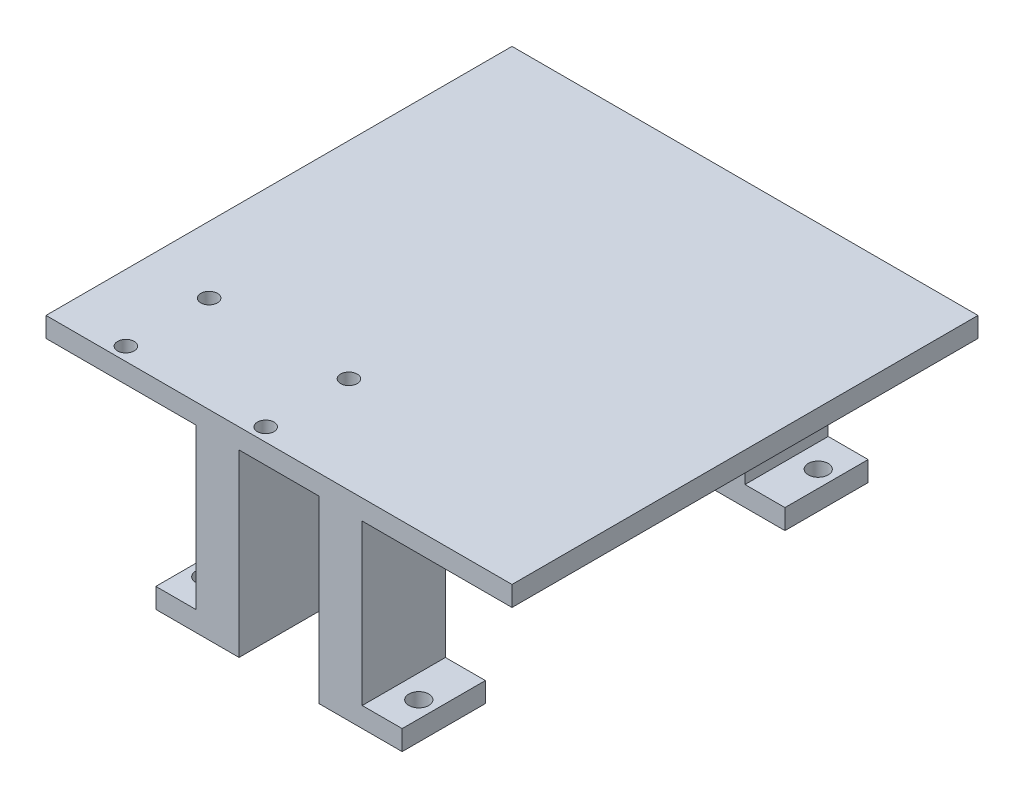
ISO-10303-21;
HEADER;
FILE_DESCRIPTION(('STEP AP214'),'2;1');
FILE_NAME('part.step','',(''),(''),'','','');
FILE_SCHEMA(('AUTOMOTIVE_DESIGN { 1 0 10303 214 1 1 1 1 }'));
ENDSEC;
DATA;
#1=APPLICATION_CONTEXT('core data for automotive mechanical design processes');
#2=APPLICATION_PROTOCOL_DEFINITION('international standard','automotive_design',2000,#1);
#3=PRODUCT_CONTEXT('',#1,'mechanical');
#4=PRODUCT('Part','Part','',(#3));
#5=PRODUCT_RELATED_PRODUCT_CATEGORY('part','',(#4));
#6=PRODUCT_DEFINITION_FORMATION('','',#4);
#7=PRODUCT_DEFINITION_CONTEXT('part definition',#1,'design');
#8=PRODUCT_DEFINITION('design','',#6,#7);
#9=PRODUCT_DEFINITION_SHAPE('','',#8);
#10=(LENGTH_UNIT() NAMED_UNIT(*) SI_UNIT(.MILLI.,.METRE.));
#11=(NAMED_UNIT(*) PLANE_ANGLE_UNIT() SI_UNIT($,.RADIAN.));
#12=(NAMED_UNIT(*) SI_UNIT($,.STERADIAN.) SOLID_ANGLE_UNIT());
#13=UNCERTAINTY_MEASURE_WITH_UNIT(LENGTH_MEASURE(1.E-05),#10,'distance_accuracy_value','');
#14=(GEOMETRIC_REPRESENTATION_CONTEXT(3) GLOBAL_UNCERTAINTY_ASSIGNED_CONTEXT((#13)) GLOBAL_UNIT_ASSIGNED_CONTEXT((#10,
#11,#12)) REPRESENTATION_CONTEXT('',''));
#15=CARTESIAN_POINT('',(0.,0.,0.));
#16=DIRECTION('',(0.,0.,1.));
#17=DIRECTION('',(1.,0.,0.));
#18=AXIS2_PLACEMENT_3D('',#15,#16,#17);
#19=CARTESIAN_POINT('',(18.5,0.,35.));
#20=DIRECTION('',(0.,1.,0.));
#21=DIRECTION('',(0.,0.,1.));
#22=AXIS2_PLACEMENT_3D('',#19,#20,#21);
#23=PLANE('',#22);
#24=CARTESIAN_POINT('',(-16.,0.,30.));
#25=DIRECTION('',(0.,1.,0.));
#26=DIRECTION('',(0.,0.,1.));
#27=AXIS2_PLACEMENT_3D('',#24,#25,#26);
#28=CIRCLE('',#27,1.5);
#29=CARTESIAN_POINT('',(-16.,0.,31.5));
#30=VERTEX_POINT('',#29);
#31=EDGE_CURVE('E374',#30,#30,#28,.T.);
#32=ORIENTED_EDGE('',*,*,#31,.T.);
#33=EDGE_LOOP('',(#32));
#34=FACE_BOUND('',#33,.T.);
#35=DIRECTION('',(1.,0.,0.));
#36=VECTOR('',#35,1.);
#37=CARTESIAN_POINT('',(-35.,0.,22.5));
#38=LINE('',#37,#36);
#39=CARTESIAN_POINT('',(-18.5,0.,22.5));
#40=VERTEX_POINT('',#39);
#41=CARTESIAN_POINT('',(-6.,0.,22.5));
#42=VERTEX_POINT('',#41);
#43=EDGE_CURVE('E480',#40,#42,#38,.T.);
#44=ORIENTED_EDGE('',*,*,#43,.T.);
#45=DIRECTION('',(0.,0.,1.));
#46=VECTOR('',#45,1.);
#47=CARTESIAN_POINT('',(-6.,0.,-40.));
#48=LINE('',#47,#46);
#49=CARTESIAN_POINT('',(-6.,0.,35.));
#50=VERTEX_POINT('',#49);
#51=EDGE_CURVE('E237',#42,#50,#48,.T.);
#52=ORIENTED_EDGE('',*,*,#51,.T.);
#53=DIRECTION('',(1.,0.,0.));
#54=VECTOR('',#53,1.);
#55=CARTESIAN_POINT('',(18.5,0.,35.));
#56=LINE('',#55,#54);
#57=CARTESIAN_POINT('',(-18.5,0.,35.));
#58=VERTEX_POINT('',#57);
#59=EDGE_CURVE('E522',#58,#50,#56,.T.);
#60=ORIENTED_EDGE('',*,*,#59,.F.);
#61=DIRECTION('',(0.,0.,-1.));
#62=VECTOR('',#61,1.);
#63=CARTESIAN_POINT('',(-18.5,0.,35.));
#64=LINE('',#63,#62);
#65=EDGE_CURVE('E306',#58,#40,#64,.T.);
#66=ORIENTED_EDGE('',*,*,#65,.T.);
#67=EDGE_LOOP('',(#44,#52,#60,#66));
#68=FACE_BOUND('',#67,.T.);
#69=ADVANCED_FACE('F39',(#34,#68),#23,.F.);
#70=CARTESIAN_POINT('',(-16.,0.,-30.));
#71=DIRECTION('',(0.,1.,0.));
#72=DIRECTION('',(0.,0.,1.));
#73=AXIS2_PLACEMENT_3D('',#70,#71,#72);
#74=CIRCLE('',#73,1.5);
#75=CARTESIAN_POINT('',(-16.,0.,-28.5));
#76=VERTEX_POINT('',#75);
#77=EDGE_CURVE('E415',#76,#76,#74,.T.);
#78=ORIENTED_EDGE('',*,*,#77,.T.);
#79=EDGE_LOOP('',(#78));
#80=FACE_BOUND('',#79,.T.);
#81=DIRECTION('',(1.,0.,0.));
#82=VECTOR('',#81,1.);
#83=CARTESIAN_POINT('',(18.5,0.,-35.));
#84=LINE('',#83,#82);
#85=CARTESIAN_POINT('',(-18.5,0.,-35.));
#86=VERTEX_POINT('',#85);
#87=CARTESIAN_POINT('',(-6.,0.,-35.));
#88=VERTEX_POINT('',#87);
#89=EDGE_CURVE('E244',#86,#88,#84,.T.);
#90=ORIENTED_EDGE('',*,*,#89,.T.);
#91=CARTESIAN_POINT('',(-6.,0.,-22.5));
#92=VERTEX_POINT('',#91);
#93=EDGE_CURVE('E226',#88,#92,#48,.T.);
#94=ORIENTED_EDGE('',*,*,#93,.T.);
#95=DIRECTION('',(1.,0.,0.));
#96=VECTOR('',#95,1.);
#97=CARTESIAN_POINT('',(-35.,0.,-22.5));
#98=LINE('',#97,#96);
#99=CARTESIAN_POINT('',(-18.5,0.,-22.5));
#100=VERTEX_POINT('',#99);
#101=EDGE_CURVE('E476',#100,#92,#98,.T.);
#102=ORIENTED_EDGE('',*,*,#101,.F.);
#103=EDGE_CURVE('E253',#100,#86,#64,.T.);
#104=ORIENTED_EDGE('',*,*,#103,.T.);
#105=EDGE_LOOP('',(#90,#94,#102,#104));
#106=FACE_BOUND('',#105,.T.);
#107=ADVANCED_FACE('F251',(#80,#106),#23,.F.);
#108=CARTESIAN_POINT('',(-35.,27.,22.5));
#109=DIRECTION('',(0.,0.,1.));
#110=DIRECTION('',(0.,-1.,0.));
#111=AXIS2_PLACEMENT_3D('',#108,#109,#110);
#112=PLANE('',#111);
#113=DIRECTION('',(1.,0.,0.));
#114=VECTOR('',#113,1.);
#115=CARTESIAN_POINT('',(-35.,27.,22.5));
#116=LINE('',#115,#114);
#117=CARTESIAN_POINT('',(-12.5,27.,22.5));
#118=VERTEX_POINT('',#117);
#119=CARTESIAN_POINT('',(-6.,26.9999999999999,22.5));
#120=VERTEX_POINT('',#119);
#121=EDGE_CURVE('E465',#118,#120,#116,.T.);
#122=ORIENTED_EDGE('',*,*,#121,.T.);
#123=DIRECTION('',(0.,-1.,0.));
#124=VECTOR('',#123,1.);
#125=CARTESIAN_POINT('',(-6.,27.,22.5));
#126=LINE('',#125,#124);
#127=EDGE_CURVE('E249',#120,#42,#126,.T.);
#128=ORIENTED_EDGE('',*,*,#127,.T.);
#129=ORIENTED_EDGE('',*,*,#43,.F.);
#130=DIRECTION('',(0.,-1.,0.));
#131=VECTOR('',#130,1.);
#132=CARTESIAN_POINT('',(-18.5,0.,22.5));
#133=LINE('',#132,#131);
#134=CARTESIAN_POINT('',(-18.5,3.,22.5));
#135=VERTEX_POINT('',#134);
#136=EDGE_CURVE('E363',#135,#40,#133,.T.);
#137=ORIENTED_EDGE('',*,*,#136,.F.);
#138=DIRECTION('',(-1.,0.,0.));
#139=VECTOR('',#138,1.);
#140=CARTESIAN_POINT('',(-18.5,3.,22.5));
#141=LINE('',#140,#139);
#142=CARTESIAN_POINT('',(-12.5,3.,22.5));
#143=VERTEX_POINT('',#142);
#144=EDGE_CURVE('E503',#143,#135,#141,.T.);
#145=ORIENTED_EDGE('',*,*,#144,.F.);
#146=DIRECTION('',(0.,-1.,0.));
#147=VECTOR('',#146,1.);
#148=CARTESIAN_POINT('',(-12.5,3.,22.5));
#149=LINE('',#148,#147);
#150=EDGE_CURVE('E507',#118,#143,#149,.T.);
#151=ORIENTED_EDGE('',*,*,#150,.F.);
#152=EDGE_LOOP('',(#122,#128,#129,#137,#145,#151));
#153=FACE_BOUND('',#152,.T.);
#154=ADVANCED_FACE('F674',(#153),#112,.F.);
#155=CARTESIAN_POINT('',(-35.,27.,-22.5));
#156=DIRECTION('',(0.,0.,-1.));
#157=DIRECTION('',(0.,1.,0.));
#158=AXIS2_PLACEMENT_3D('',#155,#156,#157);
#159=PLANE('',#158);
#160=ORIENTED_EDGE('',*,*,#101,.T.);
#161=DIRECTION('',(0.,1.,0.));
#162=VECTOR('',#161,1.);
#163=CARTESIAN_POINT('',(-6.,27.,-22.5));
#164=LINE('',#163,#162);
#165=CARTESIAN_POINT('',(-6.,26.9999999999999,-22.5));
#166=VERTEX_POINT('',#165);
#167=EDGE_CURVE('E11',#92,#166,#164,.T.);
#168=ORIENTED_EDGE('',*,*,#167,.T.);
#169=DIRECTION('',(1.,0.,0.));
#170=VECTOR('',#169,1.);
#171=CARTESIAN_POINT('',(-35.,27.,-22.5));
#172=LINE('',#171,#170);
#173=CARTESIAN_POINT('',(-12.5,27.,-22.5));
#174=VERTEX_POINT('',#173);
#175=EDGE_CURVE('E471',#174,#166,#172,.T.);
#176=ORIENTED_EDGE('',*,*,#175,.F.);
#177=DIRECTION('',(0.,1.,0.));
#178=VECTOR('',#177,1.);
#179=CARTESIAN_POINT('',(-12.5,2.99999999999999,-22.5));
#180=LINE('',#179,#178);
#181=CARTESIAN_POINT('',(-12.5,3.,-22.5));
#182=VERTEX_POINT('',#181);
#183=EDGE_CURVE('E487',#182,#174,#180,.T.);
#184=ORIENTED_EDGE('',*,*,#183,.F.);
#185=DIRECTION('',(1.,0.,0.));
#186=VECTOR('',#185,1.);
#187=CARTESIAN_POINT('',(-18.5,3.,-22.5));
#188=LINE('',#187,#186);
#189=CARTESIAN_POINT('',(-18.5,3.,-22.5));
#190=VERTEX_POINT('',#189);
#191=EDGE_CURVE('E469',#190,#182,#188,.T.);
#192=ORIENTED_EDGE('',*,*,#191,.F.);
#193=DIRECTION('',(0.,1.,0.));
#194=VECTOR('',#193,1.);
#195=CARTESIAN_POINT('',(-18.5,0.,-22.5));
#196=LINE('',#195,#194);
#197=EDGE_CURVE('E359',#100,#190,#196,.T.);
#198=ORIENTED_EDGE('',*,*,#197,.F.);
#199=EDGE_LOOP('',(#160,#168,#176,#184,#192,#198));
#200=FACE_BOUND('',#199,.T.);
#201=ADVANCED_FACE('F712',(#200),#159,.F.);
#202=CARTESIAN_POINT('',(16.,0.,30.));
#203=DIRECTION('',(0.,1.,0.));
#204=DIRECTION('',(0.,0.,1.));
#205=AXIS2_PLACEMENT_3D('',#202,#203,#204);
#206=CIRCLE('',#205,1.5);
#207=CARTESIAN_POINT('',(16.,0.,31.5));
#208=VERTEX_POINT('',#207);
#209=EDGE_CURVE('E416',#208,#208,#206,.T.);
#210=ORIENTED_EDGE('',*,*,#209,.T.);
#211=EDGE_LOOP('',(#210));
#212=FACE_BOUND('',#211,.T.);
#213=CARTESIAN_POINT('',(6.,0.,35.));
#214=VERTEX_POINT('',#213);
#215=CARTESIAN_POINT('',(18.5,0.,35.));
#216=VERTEX_POINT('',#215);
#217=EDGE_CURVE('E305',#214,#216,#56,.T.);
#218=ORIENTED_EDGE('',*,*,#217,.F.);
#219=DIRECTION('',(0.,0.,1.));
#220=VECTOR('',#219,1.);
#221=CARTESIAN_POINT('',(6.,0.,-40.));
#222=LINE('',#221,#220);
#223=CARTESIAN_POINT('',(6.,0.,22.5));
#224=VERTEX_POINT('',#223);
#225=EDGE_CURVE('E236',#224,#214,#222,.T.);
#226=ORIENTED_EDGE('',*,*,#225,.F.);
#227=CARTESIAN_POINT('',(18.5,0.,22.5));
#228=VERTEX_POINT('',#227);
#229=EDGE_CURVE('E464',#224,#228,#38,.T.);
#230=ORIENTED_EDGE('',*,*,#229,.T.);
#231=DIRECTION('',(0.,0.,-1.));
#232=VECTOR('',#231,1.);
#233=CARTESIAN_POINT('',(18.5,0.,35.));
#234=LINE('',#233,#232);
#235=EDGE_CURVE('E355',#216,#228,#234,.T.);
#236=ORIENTED_EDGE('',*,*,#235,.F.);
#237=EDGE_LOOP('',(#218,#226,#230,#236));
#238=FACE_BOUND('',#237,.T.);
#239=ADVANCED_FACE('F668',(#212,#238),#23,.F.);
#240=CARTESIAN_POINT('',(18.5,3.,35.));
#241=DIRECTION('',(-1.,0.,0.));
#242=DIRECTION('',(0.,0.,1.));
#243=AXIS2_PLACEMENT_3D('',#240,#241,#242);
#244=PLANE('',#243);
#245=ORIENTED_EDGE('',*,*,#235,.T.);
#246=DIRECTION('',(0.,1.,0.));
#247=VECTOR('',#246,1.);
#248=CARTESIAN_POINT('',(18.5,3.,22.5));
#249=LINE('',#248,#247);
#250=CARTESIAN_POINT('',(18.5,3.,22.5));
#251=VERTEX_POINT('',#250);
#252=EDGE_CURVE('E264',#228,#251,#249,.T.);
#253=ORIENTED_EDGE('',*,*,#252,.T.);
#254=DIRECTION('',(0.,0.,-1.));
#255=VECTOR('',#254,1.);
#256=CARTESIAN_POINT('',(18.5,3.,35.));
#257=LINE('',#256,#255);
#258=CARTESIAN_POINT('',(18.5,3.,35.));
#259=VERTEX_POINT('',#258);
#260=EDGE_CURVE('E350',#259,#251,#257,.T.);
#261=ORIENTED_EDGE('',*,*,#260,.F.);
#262=DIRECTION('',(0.,1.,0.));
#263=VECTOR('',#262,1.);
#264=CARTESIAN_POINT('',(18.5,3.,35.));
#265=LINE('',#264,#263);
#266=EDGE_CURVE('E526',#216,#259,#265,.T.);
#267=ORIENTED_EDGE('',*,*,#266,.F.);
#268=EDGE_LOOP('',(#245,#253,#261,#267));
#269=FACE_BOUND('',#268,.T.);
#270=ADVANCED_FACE('F663',(#269),#244,.F.);
#271=CARTESIAN_POINT('',(12.5,3.,35.));
#272=DIRECTION('',(0.,-1.,0.));
#273=DIRECTION('',(0.,0.,-1.));
#274=AXIS2_PLACEMENT_3D('',#271,#272,#273);
#275=PLANE('',#274);
#276=CARTESIAN_POINT('',(16.,3.,30.));
#277=DIRECTION('',(0.,-1.,0.));
#278=DIRECTION('',(0.,0.,-1.));
#279=AXIS2_PLACEMENT_3D('',#276,#277,#278);
#280=CIRCLE('',#279,1.5);
#281=CARTESIAN_POINT('',(16.,3.,28.5));
#282=VERTEX_POINT('',#281);
#283=EDGE_CURVE('E382',#282,#282,#280,.F.);
#284=ORIENTED_EDGE('',*,*,#283,.F.);
#285=EDGE_LOOP('',(#284));
#286=FACE_BOUND('',#285,.T.);
#287=ORIENTED_EDGE('',*,*,#260,.T.);
#288=DIRECTION('',(-1.,0.,0.));
#289=VECTOR('',#288,1.);
#290=CARTESIAN_POINT('',(12.5,3.,22.5));
#291=LINE('',#290,#289);
#292=CARTESIAN_POINT('',(12.5,3.,22.5));
#293=VERTEX_POINT('',#292);
#294=EDGE_CURVE('E515',#251,#293,#291,.T.);
#295=ORIENTED_EDGE('',*,*,#294,.T.);
#296=DIRECTION('',(0.,0.,-1.));
#297=VECTOR('',#296,1.);
#298=CARTESIAN_POINT('',(12.5,3.,35.));
#299=LINE('',#298,#297);
#300=CARTESIAN_POINT('',(12.5,3.,35.));
#301=VERTEX_POINT('',#300);
#302=EDGE_CURVE('E345',#301,#293,#299,.T.);
#303=ORIENTED_EDGE('',*,*,#302,.F.);
#304=DIRECTION('',(-1.,0.,0.));
#305=VECTOR('',#304,1.);
#306=CARTESIAN_POINT('',(12.5,3.,35.));
#307=LINE('',#306,#305);
#308=EDGE_CURVE('E529',#259,#301,#307,.T.);
#309=ORIENTED_EDGE('',*,*,#308,.F.);
#310=EDGE_LOOP('',(#287,#295,#303,#309));
#311=FACE_BOUND('',#310,.T.);
#312=ADVANCED_FACE('F658',(#286,#311),#275,.F.);
#313=CARTESIAN_POINT('',(12.5,27.,35.));
#314=DIRECTION('',(-1.,0.,0.));
#315=DIRECTION('',(0.,-1.,0.));
#316=AXIS2_PLACEMENT_3D('',#313,#314,#315);
#317=PLANE('',#316);
#318=ORIENTED_EDGE('',*,*,#302,.T.);
#319=DIRECTION('',(0.,1.,0.));
#320=VECTOR('',#319,1.);
#321=CARTESIAN_POINT('',(12.5,27.,22.5));
#322=LINE('',#321,#320);
#323=CARTESIAN_POINT('',(12.5,27.,22.5));
#324=VERTEX_POINT('',#323);
#325=EDGE_CURVE('E511',#293,#324,#322,.T.);
#326=ORIENTED_EDGE('',*,*,#325,.T.);
#327=DIRECTION('',(0.,0.,-1.));
#328=VECTOR('',#327,1.);
#329=CARTESIAN_POINT('',(12.5,27.,35.));
#330=LINE('',#329,#328);
#331=CARTESIAN_POINT('',(12.5,27.,35.));
#332=VERTEX_POINT('',#331);
#333=EDGE_CURVE('E340',#332,#324,#330,.T.);
#334=ORIENTED_EDGE('',*,*,#333,.F.);
#335=DIRECTION('',(0.,1.,0.));
#336=VECTOR('',#335,1.);
#337=CARTESIAN_POINT('',(12.5,27.,35.));
#338=LINE('',#337,#336);
#339=EDGE_CURVE('E532',#301,#332,#338,.T.);
#340=ORIENTED_EDGE('',*,*,#339,.F.);
#341=EDGE_LOOP('',(#318,#326,#334,#340));
#342=FACE_BOUND('',#341,.T.);
#343=ADVANCED_FACE('F651',(#342),#317,.F.);
#344=CARTESIAN_POINT('',(-12.5,3.,35.));
#345=DIRECTION('',(1.,0.,0.));
#346=DIRECTION('',(0.,1.,0.));
#347=AXIS2_PLACEMENT_3D('',#344,#345,#346);
#348=PLANE('',#347);
#349=DIRECTION('',(0.,0.,-1.));
#350=VECTOR('',#349,1.);
#351=CARTESIAN_POINT('',(-12.5,27.,35.));
#352=LINE('',#351,#350);
#353=CARTESIAN_POINT('',(-12.5,27.,35.));
#354=VERTEX_POINT('',#353);
#355=EDGE_CURVE('E321',#354,#118,#352,.T.);
#356=ORIENTED_EDGE('',*,*,#355,.T.);
#357=ORIENTED_EDGE('',*,*,#150,.T.);
#358=DIRECTION('',(0.,0.,-1.));
#359=VECTOR('',#358,1.);
#360=CARTESIAN_POINT('',(-12.5,3.,35.));
#361=LINE('',#360,#359);
#362=CARTESIAN_POINT('',(-12.5,3.,35.));
#363=VERTEX_POINT('',#362);
#364=EDGE_CURVE('E316',#363,#143,#361,.T.);
#365=ORIENTED_EDGE('',*,*,#364,.F.);
#366=DIRECTION('',(0.,-1.,0.));
#367=VECTOR('',#366,1.);
#368=CARTESIAN_POINT('',(-12.5,3.,35.));
#369=LINE('',#368,#367);
#370=EDGE_CURVE('E550',#354,#363,#369,.T.);
#371=ORIENTED_EDGE('',*,*,#370,.F.);
#372=EDGE_LOOP('',(#356,#357,#365,#371));
#373=FACE_BOUND('',#372,.T.);
#374=ADVANCED_FACE('F682',(#373),#348,.F.);
#375=CARTESIAN_POINT('',(-18.5,3.,35.));
#376=DIRECTION('',(0.,-1.,0.));
#377=DIRECTION('',(0.,0.,-1.));
#378=AXIS2_PLACEMENT_3D('',#375,#376,#377);
#379=PLANE('',#378);
#380=CARTESIAN_POINT('',(-16.,3.,30.));
#381=DIRECTION('',(0.,-1.,0.));
#382=DIRECTION('',(0.,0.,-1.));
#383=AXIS2_PLACEMENT_3D('',#380,#381,#382);
#384=CIRCLE('',#383,1.5);
#385=CARTESIAN_POINT('',(-16.,3.,28.5));
#386=VERTEX_POINT('',#385);
#387=EDGE_CURVE('E378',#386,#386,#384,.F.);
#388=ORIENTED_EDGE('',*,*,#387,.F.);
#389=EDGE_LOOP('',(#388));
#390=FACE_BOUND('',#389,.T.);
#391=ORIENTED_EDGE('',*,*,#364,.T.);
#392=ORIENTED_EDGE('',*,*,#144,.T.);
#393=DIRECTION('',(0.,0.,-1.));
#394=VECTOR('',#393,1.);
#395=CARTESIAN_POINT('',(-18.5,3.,35.));
#396=LINE('',#395,#394);
#397=CARTESIAN_POINT('',(-18.5,3.,35.));
#398=VERTEX_POINT('',#397);
#399=EDGE_CURVE('E311',#398,#135,#396,.T.);
#400=ORIENTED_EDGE('',*,*,#399,.F.);
#401=DIRECTION('',(-1.,0.,0.));
#402=VECTOR('',#401,1.);
#403=CARTESIAN_POINT('',(-18.5,3.,35.));
#404=LINE('',#403,#402);
#405=EDGE_CURVE('E552',#363,#398,#404,.T.);
#406=ORIENTED_EDGE('',*,*,#405,.F.);
#407=EDGE_LOOP('',(#391,#392,#400,#406));
#408=FACE_BOUND('',#407,.T.);
#409=ADVANCED_FACE('F680',(#390,#408),#379,.F.);
#410=CARTESIAN_POINT('',(-18.5,0.,35.));
#411=DIRECTION('',(1.,0.,0.));
#412=DIRECTION('',(0.,0.,-1.));
#413=AXIS2_PLACEMENT_3D('',#410,#411,#412);
#414=PLANE('',#413);
#415=ORIENTED_EDGE('',*,*,#399,.T.);
#416=ORIENTED_EDGE('',*,*,#136,.T.);
#417=ORIENTED_EDGE('',*,*,#65,.F.);
#418=DIRECTION('',(0.,-1.,0.));
#419=VECTOR('',#418,1.);
#420=CARTESIAN_POINT('',(-18.5,0.,35.));
#421=LINE('',#420,#419);
#422=EDGE_CURVE('E266',#398,#58,#421,.T.);
#423=ORIENTED_EDGE('',*,*,#422,.F.);
#424=EDGE_LOOP('',(#415,#416,#417,#423));
#425=FACE_BOUND('',#424,.T.);
#426=ADVANCED_FACE('F678',(#425),#414,.F.);
#427=CARTESIAN_POINT('',(16.,0.,-30.));
#428=DIRECTION('',(0.,1.,0.));
#429=DIRECTION('',(0.,0.,1.));
#430=AXIS2_PLACEMENT_3D('',#427,#428,#429);
#431=CIRCLE('',#430,1.5);
#432=CARTESIAN_POINT('',(16.,0.,-28.5));
#433=VERTEX_POINT('',#432);
#434=EDGE_CURVE('E420',#433,#433,#431,.T.);
#435=ORIENTED_EDGE('',*,*,#434,.T.);
#436=EDGE_LOOP('',(#435));
#437=FACE_BOUND('',#436,.T.);
#438=CARTESIAN_POINT('',(5.99999999999999,0.,-22.5));
#439=VERTEX_POINT('',#438);
#440=CARTESIAN_POINT('',(18.5,0.,-22.5));
#441=VERTEX_POINT('',#440);
#442=EDGE_CURVE('E479',#439,#441,#98,.T.);
#443=ORIENTED_EDGE('',*,*,#442,.F.);
#444=CARTESIAN_POINT('',(6.,0.,-35.));
#445=VERTEX_POINT('',#444);
#446=EDGE_CURVE('E65',#445,#439,#222,.T.);
#447=ORIENTED_EDGE('',*,*,#446,.F.);
#448=CARTESIAN_POINT('',(18.5,0.,-35.));
#449=VERTEX_POINT('',#448);
#450=EDGE_CURVE('E257',#445,#449,#84,.T.);
#451=ORIENTED_EDGE('',*,*,#450,.T.);
#452=EDGE_CURVE('E354',#441,#449,#234,.T.);
#453=ORIENTED_EDGE('',*,*,#452,.F.);
#454=EDGE_LOOP('',(#443,#447,#451,#453));
#455=FACE_BOUND('',#454,.T.);
#456=ADVANCED_FACE('F41',(#437,#455),#23,.F.);
#457=CARTESIAN_POINT('',(18.5,3.,-22.5));
#458=VERTEX_POINT('',#457);
#459=CARTESIAN_POINT('',(18.5,3.,-35.));
#460=VERTEX_POINT('',#459);
#461=EDGE_CURVE('E349',#458,#460,#257,.T.);
#462=ORIENTED_EDGE('',*,*,#461,.F.);
#463=DIRECTION('',(0.,-1.,0.));
#464=VECTOR('',#463,1.);
#465=CARTESIAN_POINT('',(18.5,2.99999999999999,-22.5));
#466=LINE('',#465,#464);
#467=EDGE_CURVE('E499',#458,#441,#466,.T.);
#468=ORIENTED_EDGE('',*,*,#467,.T.);
#469=ORIENTED_EDGE('',*,*,#452,.T.);
#470=DIRECTION('',(0.,1.,0.));
#471=VECTOR('',#470,1.);
#472=CARTESIAN_POINT('',(18.5,3.,-35.));
#473=LINE('',#472,#471);
#474=EDGE_CURVE('E256',#449,#460,#473,.T.);
#475=ORIENTED_EDGE('',*,*,#474,.T.);
#476=EDGE_LOOP('',(#462,#468,#469,#475));
#477=FACE_BOUND('',#476,.T.);
#478=ADVANCED_FACE('F573',(#477),#244,.F.);
#479=CARTESIAN_POINT('',(16.,3.,-30.));
#480=DIRECTION('',(0.,-1.,0.));
#481=DIRECTION('',(0.,0.,-1.));
#482=AXIS2_PLACEMENT_3D('',#479,#480,#481);
#483=CIRCLE('',#482,1.5);
#484=CARTESIAN_POINT('',(16.,3.,-31.5));
#485=VERTEX_POINT('',#484);
#486=EDGE_CURVE('E373',#485,#485,#483,.F.);
#487=ORIENTED_EDGE('',*,*,#486,.F.);
#488=EDGE_LOOP('',(#487));
#489=FACE_BOUND('',#488,.T.);
#490=CARTESIAN_POINT('',(12.5,3.,-22.5));
#491=VERTEX_POINT('',#490);
#492=CARTESIAN_POINT('',(12.5,3.,-35.));
#493=VERTEX_POINT('',#492);
#494=EDGE_CURVE('E344',#491,#493,#299,.T.);
#495=ORIENTED_EDGE('',*,*,#494,.F.);
#496=DIRECTION('',(1.,0.,0.));
#497=VECTOR('',#496,1.);
#498=CARTESIAN_POINT('',(12.5,3.,-22.5));
#499=LINE('',#498,#497);
#500=EDGE_CURVE('E495',#491,#458,#499,.T.);
#501=ORIENTED_EDGE('',*,*,#500,.T.);
#502=ORIENTED_EDGE('',*,*,#461,.T.);
#503=DIRECTION('',(-1.,0.,0.));
#504=VECTOR('',#503,1.);
#505=CARTESIAN_POINT('',(12.5,3.,-35.));
#506=LINE('',#505,#504);
#507=EDGE_CURVE('E262',#460,#493,#506,.T.);
#508=ORIENTED_EDGE('',*,*,#507,.T.);
#509=EDGE_LOOP('',(#495,#501,#502,#508));
#510=FACE_BOUND('',#509,.T.);
#511=ADVANCED_FACE('F582',(#489,#510),#275,.F.);
#512=CARTESIAN_POINT('',(12.5,27.,-22.5));
#513=VERTEX_POINT('',#512);
#514=CARTESIAN_POINT('',(12.5,27.,-35.));
#515=VERTEX_POINT('',#514);
#516=EDGE_CURVE('E339',#513,#515,#330,.T.);
#517=ORIENTED_EDGE('',*,*,#516,.F.);
#518=DIRECTION('',(0.,-1.,0.));
#519=VECTOR('',#518,1.);
#520=CARTESIAN_POINT('',(12.5,27.,-22.5));
#521=LINE('',#520,#519);
#522=EDGE_CURVE('E491',#513,#491,#521,.T.);
#523=ORIENTED_EDGE('',*,*,#522,.T.);
#524=ORIENTED_EDGE('',*,*,#494,.T.);
#525=DIRECTION('',(0.,1.,0.));
#526=VECTOR('',#525,1.);
#527=CARTESIAN_POINT('',(12.5,27.,-35.));
#528=LINE('',#527,#526);
#529=EDGE_CURVE('E272',#493,#515,#528,.T.);
#530=ORIENTED_EDGE('',*,*,#529,.T.);
#531=EDGE_LOOP('',(#517,#523,#524,#530));
#532=FACE_BOUND('',#531,.T.);
#533=ADVANCED_FACE('F589',(#532),#317,.F.);
#534=CARTESIAN_POINT('',(35.,30.,35.));
#535=DIRECTION('',(-1.,0.,0.));
#536=DIRECTION('',(0.,0.,1.));
#537=AXIS2_PLACEMENT_3D('',#534,#535,#536);
#538=PLANE('',#537);
#539=DIRECTION('',(0.,1.,0.));
#540=VECTOR('',#539,1.);
#541=CARTESIAN_POINT('',(35.,30.,-35.));
#542=LINE('',#541,#540);
#543=CARTESIAN_POINT('',(35.,27.,-35.));
#544=VERTEX_POINT('',#543);
#545=CARTESIAN_POINT('',(35.,30.,-35.));
#546=VERTEX_POINT('',#545);
#547=EDGE_CURVE('E280',#544,#546,#542,.T.);
#548=ORIENTED_EDGE('',*,*,#547,.T.);
#549=DIRECTION('',(0.,0.,-1.));
#550=VECTOR('',#549,1.);
#551=CARTESIAN_POINT('',(35.,30.,35.));
#552=LINE('',#551,#550);
#553=CARTESIAN_POINT('',(35.,30.,35.));
#554=VERTEX_POINT('',#553);
#555=EDGE_CURVE('E332',#554,#546,#552,.T.);
#556=ORIENTED_EDGE('',*,*,#555,.F.);
#557=DIRECTION('',(0.,1.,0.));
#558=VECTOR('',#557,1.);
#559=CARTESIAN_POINT('',(35.,30.,35.));
#560=LINE('',#559,#558);
#561=CARTESIAN_POINT('',(35.,27.,35.));
#562=VERTEX_POINT('',#561);
#563=EDGE_CURVE('E538',#562,#554,#560,.T.);
#564=ORIENTED_EDGE('',*,*,#563,.F.);
#565=DIRECTION('',(0.,0.,-1.));
#566=VECTOR('',#565,1.);
#567=CARTESIAN_POINT('',(35.,27.,35.));
#568=LINE('',#567,#566);
#569=EDGE_CURVE('E336',#562,#544,#568,.T.);
#570=ORIENTED_EDGE('',*,*,#569,.T.);
#571=EDGE_LOOP('',(#548,#556,#564,#570));
#572=FACE_BOUND('',#571,.T.);
#573=ADVANCED_FACE('F620',(#572),#538,.F.);
#574=CARTESIAN_POINT('',(-35.,30.,35.));
#575=DIRECTION('',(0.,-1.,0.));
#576=DIRECTION('',(0.,0.,-1.));
#577=AXIS2_PLACEMENT_3D('',#574,#575,#576);
#578=PLANE('',#577);
#579=CARTESIAN_POINT('',(-25.,30.,20.5));
#580=DIRECTION('',(0.,-1.,0.));
#581=DIRECTION('',(0.,0.,-1.));
#582=AXIS2_PLACEMENT_3D('',#579,#580,#581);
#583=CIRCLE('',#582,1.25);
#584=CARTESIAN_POINT('',(-25.,30.,19.25));
#585=VERTEX_POINT('',#584);
#586=EDGE_CURVE('E411',#585,#585,#583,.T.);
#587=ORIENTED_EDGE('',*,*,#586,.T.);
#588=EDGE_LOOP('',(#587));
#589=FACE_BOUND('',#588,.T.);
#590=CARTESIAN_POINT('',(-25.,30.,33.));
#591=DIRECTION('',(0.,-1.,0.));
#592=DIRECTION('',(0.,0.,-1.));
#593=AXIS2_PLACEMENT_3D('',#590,#591,#592);
#594=CIRCLE('',#593,1.25);
#595=CARTESIAN_POINT('',(-25.,30.,31.75));
#596=VERTEX_POINT('',#595);
#597=EDGE_CURVE('E398',#596,#596,#594,.T.);
#598=ORIENTED_EDGE('',*,*,#597,.T.);
#599=EDGE_LOOP('',(#598));
#600=FACE_BOUND('',#599,.T.);
#601=CARTESIAN_POINT('',(-4.00000000000002,30.,33.));
#602=DIRECTION('',(0.,-1.,0.));
#603=DIRECTION('',(0.,0.,-1.));
#604=AXIS2_PLACEMENT_3D('',#601,#602,#603);
#605=CIRCLE('',#604,1.25);
#606=CARTESIAN_POINT('',(-4.00000000000002,30.,31.75));
#607=VERTEX_POINT('',#606);
#608=EDGE_CURVE('E394',#607,#607,#605,.T.);
#609=ORIENTED_EDGE('',*,*,#608,.T.);
#610=EDGE_LOOP('',(#609));
#611=FACE_BOUND('',#610,.T.);
#612=CARTESIAN_POINT('',(-4.00000000000002,30.,20.5));
#613=DIRECTION('',(0.,-1.,0.));
#614=DIRECTION('',(0.,0.,-1.));
#615=AXIS2_PLACEMENT_3D('',#612,#613,#614);
#616=CIRCLE('',#615,1.25);
#617=CARTESIAN_POINT('',(-4.00000000000002,30.,19.25));
#618=VERTEX_POINT('',#617);
#619=EDGE_CURVE('E390',#618,#618,#616,.T.);
#620=ORIENTED_EDGE('',*,*,#619,.T.);
#621=EDGE_LOOP('',(#620));
#622=FACE_BOUND('',#621,.T.);
#623=DIRECTION('',(-1.,0.,0.));
#624=VECTOR('',#623,1.);
#625=CARTESIAN_POINT('',(-35.,30.,-35.));
#626=LINE('',#625,#624);
#627=CARTESIAN_POINT('',(-35.,30.,-35.));
#628=VERTEX_POINT('',#627);
#629=EDGE_CURVE('E283',#546,#628,#626,.T.);
#630=ORIENTED_EDGE('',*,*,#629,.T.);
#631=DIRECTION('',(0.,0.,-1.));
#632=VECTOR('',#631,1.);
#633=CARTESIAN_POINT('',(-35.,30.,35.));
#634=LINE('',#633,#632);
#635=CARTESIAN_POINT('',(-35.,30.,35.));
#636=VERTEX_POINT('',#635);
#637=EDGE_CURVE('E328',#636,#628,#634,.T.);
#638=ORIENTED_EDGE('',*,*,#637,.F.);
#639=DIRECTION('',(-1.,0.,0.));
#640=VECTOR('',#639,1.);
#641=CARTESIAN_POINT('',(-35.,30.,35.));
#642=LINE('',#641,#640);
#643=EDGE_CURVE('E541',#554,#636,#642,.T.);
#644=ORIENTED_EDGE('',*,*,#643,.F.);
#645=ORIENTED_EDGE('',*,*,#555,.T.);
#646=EDGE_LOOP('',(#630,#638,#644,#645));
#647=FACE_BOUND('',#646,.T.);
#648=ADVANCED_FACE('F616',(#589,#600,#611,#622,#647),#578,.F.);
#649=CARTESIAN_POINT('',(-35.,27.,35.));
#650=DIRECTION('',(1.,0.,0.));
#651=DIRECTION('',(0.,0.,-1.));
#652=AXIS2_PLACEMENT_3D('',#649,#650,#651);
#653=PLANE('',#652);
#654=DIRECTION('',(0.,-1.,0.));
#655=VECTOR('',#654,1.);
#656=CARTESIAN_POINT('',(-35.,27.,-35.));
#657=LINE('',#656,#655);
#658=CARTESIAN_POINT('',(-35.,27.,-35.));
#659=VERTEX_POINT('',#658);
#660=EDGE_CURVE('E286',#628,#659,#657,.T.);
#661=ORIENTED_EDGE('',*,*,#660,.T.);
#662=DIRECTION('',(0.,0.,-1.));
#663=VECTOR('',#662,1.);
#664=CARTESIAN_POINT('',(-35.,27.,35.));
#665=LINE('',#664,#663);
#666=CARTESIAN_POINT('',(-35.,27.,35.));
#667=VERTEX_POINT('',#666);
#668=EDGE_CURVE('E325',#667,#659,#665,.T.);
#669=ORIENTED_EDGE('',*,*,#668,.F.);
#670=DIRECTION('',(0.,-1.,0.));
#671=VECTOR('',#670,1.);
#672=CARTESIAN_POINT('',(-35.,27.,35.));
#673=LINE('',#672,#671);
#674=EDGE_CURVE('E544',#636,#667,#673,.T.);
#675=ORIENTED_EDGE('',*,*,#674,.F.);
#676=ORIENTED_EDGE('',*,*,#637,.T.);
#677=EDGE_LOOP('',(#661,#669,#675,#676));
#678=FACE_BOUND('',#677,.T.);
#679=ADVANCED_FACE('F619',(#678),#653,.F.);
#680=CARTESIAN_POINT('',(-12.5,27.,35.));
#681=DIRECTION('',(0.,1.,0.));
#682=DIRECTION('',(-1.,0.,0.));
#683=AXIS2_PLACEMENT_3D('',#680,#681,#682);
#684=PLANE('',#683);
#685=CARTESIAN_POINT('',(-25.,27.,20.5));
#686=DIRECTION('',(0.,1.,0.));
#687=DIRECTION('',(-1.,0.,0.));
#688=AXIS2_PLACEMENT_3D('',#685,#686,#687);
#689=CIRCLE('',#688,1.25);
#690=CARTESIAN_POINT('',(-26.25,27.,20.5));
#691=VERTEX_POINT('',#690);
#692=EDGE_CURVE('E43',#691,#691,#689,.T.);
#693=ORIENTED_EDGE('',*,*,#692,.T.);
#694=EDGE_LOOP('',(#693));
#695=FACE_BOUND('',#694,.T.);
#696=CARTESIAN_POINT('',(-25.,27.,33.));
#697=DIRECTION('',(0.,1.,0.));
#698=DIRECTION('',(-1.,0.,0.));
#699=AXIS2_PLACEMENT_3D('',#696,#697,#698);
#700=CIRCLE('',#699,1.25);
#701=CARTESIAN_POINT('',(-26.25,27.,33.));
#702=VERTEX_POINT('',#701);
#703=EDGE_CURVE('E395',#702,#702,#700,.T.);
#704=ORIENTED_EDGE('',*,*,#703,.T.);
#705=EDGE_LOOP('',(#704));
#706=FACE_BOUND('',#705,.T.);
#707=CARTESIAN_POINT('',(-4.00000000000002,27.,33.));
#708=DIRECTION('',(0.,1.,0.));
#709=DIRECTION('',(-1.,0.,0.));
#710=AXIS2_PLACEMENT_3D('',#707,#708,#709);
#711=CIRCLE('',#710,1.25);
#712=CARTESIAN_POINT('',(-5.25000000000002,27.,33.));
#713=VERTEX_POINT('',#712);
#714=EDGE_CURVE('E391',#713,#713,#711,.T.);
#715=ORIENTED_EDGE('',*,*,#714,.T.);
#716=EDGE_LOOP('',(#715));
#717=FACE_BOUND('',#716,.T.);
#718=CARTESIAN_POINT('',(-4.00000000000002,27.,20.5));
#719=DIRECTION('',(0.,1.,0.));
#720=DIRECTION('',(-1.,0.,0.));
#721=AXIS2_PLACEMENT_3D('',#718,#719,#720);
#722=CIRCLE('',#721,1.25);
#723=CARTESIAN_POINT('',(-5.25000000000002,27.,20.5));
#724=VERTEX_POINT('',#723);
#725=EDGE_CURVE('E386',#724,#724,#722,.T.);
#726=ORIENTED_EDGE('',*,*,#725,.T.);
#727=EDGE_LOOP('',(#726));
#728=FACE_BOUND('',#727,.T.);
#729=CARTESIAN_POINT('',(6.,27.,22.5));
#730=VERTEX_POINT('',#729);
#731=EDGE_CURVE('E470',#730,#324,#116,.T.);
#732=ORIENTED_EDGE('',*,*,#731,.F.);
#733=DIRECTION('',(0.,0.,1.));
#734=VECTOR('',#733,1.);
#735=CARTESIAN_POINT('',(6.,26.9999999999999,-40.));
#736=LINE('',#735,#734);
#737=CARTESIAN_POINT('',(6.,26.9999999999999,35.));
#738=VERTEX_POINT('',#737);
#739=EDGE_CURVE('E57',#730,#738,#736,.T.);
#740=ORIENTED_EDGE('',*,*,#739,.T.);
#741=DIRECTION('',(1.,0.,0.));
#742=VECTOR('',#741,1.);
#743=CARTESIAN_POINT('',(0.,26.9999999999999,35.));
#744=LINE('',#743,#742);
#745=CARTESIAN_POINT('',(-6.,26.9999999999999,35.));
#746=VERTEX_POINT('',#745);
#747=EDGE_CURVE('E454',#746,#738,#744,.T.);
#748=ORIENTED_EDGE('',*,*,#747,.F.);
#749=DIRECTION('',(0.,0.,1.));
#750=VECTOR('',#749,1.);
#751=CARTESIAN_POINT('',(-6.,26.9999999999999,-40.));
#752=LINE('',#751,#750);
#753=EDGE_CURVE('E430',#120,#746,#752,.T.);
#754=ORIENTED_EDGE('',*,*,#753,.F.);
#755=ORIENTED_EDGE('',*,*,#121,.F.);
#756=ORIENTED_EDGE('',*,*,#355,.F.);
#757=DIRECTION('',(1.,0.,0.));
#758=VECTOR('',#757,1.);
#759=CARTESIAN_POINT('',(-12.5,27.,35.));
#760=LINE('',#759,#758);
#761=EDGE_CURVE('E547',#667,#354,#760,.T.);
#762=ORIENTED_EDGE('',*,*,#761,.F.);
#763=ORIENTED_EDGE('',*,*,#668,.T.);
#764=DIRECTION('',(1.,0.,0.));
#765=VECTOR('',#764,1.);
#766=CARTESIAN_POINT('',(-12.5,27.,-35.));
#767=LINE('',#766,#765);
#768=CARTESIAN_POINT('',(-12.5,27.,-35.));
#769=VERTEX_POINT('',#768);
#770=EDGE_CURVE('E290',#659,#769,#767,.T.);
#771=ORIENTED_EDGE('',*,*,#770,.T.);
#772=EDGE_CURVE('E320',#174,#769,#352,.T.);
#773=ORIENTED_EDGE('',*,*,#772,.F.);
#774=ORIENTED_EDGE('',*,*,#175,.T.);
#775=CARTESIAN_POINT('',(-6.,26.9999999999999,-35.));
#776=VERTEX_POINT('',#775);
#777=EDGE_CURVE('E434',#776,#166,#752,.T.);
#778=ORIENTED_EDGE('',*,*,#777,.F.);
#779=DIRECTION('',(1.,0.,0.));
#780=VECTOR('',#779,1.);
#781=CARTESIAN_POINT('',(0.,26.9999999999999,-35.));
#782=LINE('',#781,#780);
#783=CARTESIAN_POINT('',(6.,26.9999999999999,-35.));
#784=VERTEX_POINT('',#783);
#785=EDGE_CURVE('E246',#776,#784,#782,.T.);
#786=ORIENTED_EDGE('',*,*,#785,.T.);
#787=CARTESIAN_POINT('',(6.,26.9999999999999,-22.5));
#788=VERTEX_POINT('',#787);
#789=EDGE_CURVE('E435',#784,#788,#736,.T.);
#790=ORIENTED_EDGE('',*,*,#789,.T.);
#791=EDGE_CURVE('E475',#788,#513,#172,.T.);
#792=ORIENTED_EDGE('',*,*,#791,.T.);
#793=ORIENTED_EDGE('',*,*,#516,.T.);
#794=DIRECTION('',(1.,0.,0.));
#795=VECTOR('',#794,1.);
#796=CARTESIAN_POINT('',(35.,27.,-35.));
#797=LINE('',#796,#795);
#798=EDGE_CURVE('E276',#515,#544,#797,.T.);
#799=ORIENTED_EDGE('',*,*,#798,.T.);
#800=ORIENTED_EDGE('',*,*,#569,.F.);
#801=DIRECTION('',(1.,0.,0.));
#802=VECTOR('',#801,1.);
#803=CARTESIAN_POINT('',(35.,27.,35.));
#804=LINE('',#803,#802);
#805=EDGE_CURVE('E535',#332,#562,#804,.T.);
#806=ORIENTED_EDGE('',*,*,#805,.F.);
#807=ORIENTED_EDGE('',*,*,#333,.T.);
#808=EDGE_LOOP('',(#732,#740,#748,#754,#755,#756,#762,#763,#771,#773,#774,#778,#786,#790,#792,
#793,#799,#800,#806,#807));
#809=FACE_BOUND('',#808,.T.);
#810=ADVANCED_FACE('F592',(#695,#706,#717,#728,#809),#684,.F.);
#811=CARTESIAN_POINT('',(-12.5,3.,-35.));
#812=VERTEX_POINT('',#811);
#813=EDGE_CURVE('E315',#182,#812,#361,.T.);
#814=ORIENTED_EDGE('',*,*,#813,.F.);
#815=ORIENTED_EDGE('',*,*,#183,.T.);
#816=ORIENTED_EDGE('',*,*,#772,.T.);
#817=DIRECTION('',(0.,-1.,0.));
#818=VECTOR('',#817,1.);
#819=CARTESIAN_POINT('',(-12.5,3.,-35.));
#820=LINE('',#819,#818);
#821=EDGE_CURVE('E294',#769,#812,#820,.T.);
#822=ORIENTED_EDGE('',*,*,#821,.T.);
#823=EDGE_LOOP('',(#814,#815,#816,#822));
#824=FACE_BOUND('',#823,.T.);
#825=ADVANCED_FACE('F685',(#824),#348,.F.);
#826=CARTESIAN_POINT('',(-16.,3.,-30.));
#827=DIRECTION('',(0.,-1.,0.));
#828=DIRECTION('',(0.,0.,-1.));
#829=AXIS2_PLACEMENT_3D('',#826,#827,#828);
#830=CIRCLE('',#829,1.5);
#831=CARTESIAN_POINT('',(-16.,3.,-31.5));
#832=VERTEX_POINT('',#831);
#833=EDGE_CURVE('E369',#832,#832,#830,.F.);
#834=ORIENTED_EDGE('',*,*,#833,.F.);
#835=EDGE_LOOP('',(#834));
#836=FACE_BOUND('',#835,.T.);
#837=CARTESIAN_POINT('',(-18.5,3.,-35.));
#838=VERTEX_POINT('',#837);
#839=EDGE_CURVE('E310',#190,#838,#396,.T.);
#840=ORIENTED_EDGE('',*,*,#839,.F.);
#841=ORIENTED_EDGE('',*,*,#191,.T.);
#842=ORIENTED_EDGE('',*,*,#813,.T.);
#843=DIRECTION('',(-1.,0.,0.));
#844=VECTOR('',#843,1.);
#845=CARTESIAN_POINT('',(-18.5,3.,-35.));
#846=LINE('',#845,#844);
#847=EDGE_CURVE('E298',#812,#838,#846,.T.);
#848=ORIENTED_EDGE('',*,*,#847,.T.);
#849=EDGE_LOOP('',(#840,#841,#842,#848));
#850=FACE_BOUND('',#849,.T.);
#851=ADVANCED_FACE('F692',(#836,#850),#379,.F.);
#852=ORIENTED_EDGE('',*,*,#103,.F.);
#853=ORIENTED_EDGE('',*,*,#197,.T.);
#854=ORIENTED_EDGE('',*,*,#839,.T.);
#855=DIRECTION('',(0.,-1.,0.));
#856=VECTOR('',#855,1.);
#857=CARTESIAN_POINT('',(-18.5,0.,-35.));
#858=LINE('',#857,#856);
#859=EDGE_CURVE('E302',#838,#86,#858,.T.);
#860=ORIENTED_EDGE('',*,*,#859,.T.);
#861=EDGE_LOOP('',(#852,#853,#854,#860));
#862=FACE_BOUND('',#861,.T.);
#863=ADVANCED_FACE('F710',(#862),#414,.F.);
#864=CARTESIAN_POINT('',(0.,0.,35.));
#865=DIRECTION('',(0.,0.,-1.));
#866=DIRECTION('',(-1.,0.,0.));
#867=AXIS2_PLACEMENT_3D('',#864,#865,#866);
#868=PLANE('',#867);
#869=ORIENTED_EDGE('',*,*,#59,.T.);
#870=DIRECTION('',(0.,1.,0.));
#871=VECTOR('',#870,1.);
#872=CARTESIAN_POINT('',(-6.,0.,35.));
#873=LINE('',#872,#871);
#874=EDGE_CURVE('E248',#50,#746,#873,.T.);
#875=ORIENTED_EDGE('',*,*,#874,.T.);
#876=ORIENTED_EDGE('',*,*,#747,.T.);
#877=DIRECTION('',(0.,-1.,0.));
#878=VECTOR('',#877,1.);
#879=CARTESIAN_POINT('',(6.,0.,35.));
#880=LINE('',#879,#878);
#881=EDGE_CURVE('E448',#738,#214,#880,.T.);
#882=ORIENTED_EDGE('',*,*,#881,.T.);
#883=ORIENTED_EDGE('',*,*,#217,.T.);
#884=ORIENTED_EDGE('',*,*,#266,.T.);
#885=ORIENTED_EDGE('',*,*,#308,.T.);
#886=ORIENTED_EDGE('',*,*,#339,.T.);
#887=ORIENTED_EDGE('',*,*,#805,.T.);
#888=ORIENTED_EDGE('',*,*,#563,.T.);
#889=ORIENTED_EDGE('',*,*,#643,.T.);
#890=ORIENTED_EDGE('',*,*,#674,.T.);
#891=ORIENTED_EDGE('',*,*,#761,.T.);
#892=ORIENTED_EDGE('',*,*,#370,.T.);
#893=ORIENTED_EDGE('',*,*,#405,.T.);
#894=ORIENTED_EDGE('',*,*,#422,.T.);
#895=EDGE_LOOP('',(#869,#875,#876,#882,#883,#884,#885,#886,#887,#888,#889,#890,#891,#892,#893,#894));
#896=FACE_BOUND('',#895,.T.);
#897=ADVANCED_FACE('F643',(#896),#868,.F.);
#898=CARTESIAN_POINT('',(0.,0.,-35.));
#899=DIRECTION('',(0.,0.,-1.));
#900=DIRECTION('',(-1.,0.,0.));
#901=AXIS2_PLACEMENT_3D('',#898,#899,#900);
#902=PLANE('',#901);
#903=DIRECTION('',(0.,1.,0.));
#904=VECTOR('',#903,1.);
#905=CARTESIAN_POINT('',(-6.,0.,-35.));
#906=LINE('',#905,#904);
#907=EDGE_CURVE('E229',#88,#776,#906,.T.);
#908=ORIENTED_EDGE('',*,*,#907,.F.);
#909=ORIENTED_EDGE('',*,*,#89,.F.);
#910=ORIENTED_EDGE('',*,*,#859,.F.);
#911=ORIENTED_EDGE('',*,*,#847,.F.);
#912=ORIENTED_EDGE('',*,*,#821,.F.);
#913=ORIENTED_EDGE('',*,*,#770,.F.);
#914=ORIENTED_EDGE('',*,*,#660,.F.);
#915=ORIENTED_EDGE('',*,*,#629,.F.);
#916=ORIENTED_EDGE('',*,*,#547,.F.);
#917=ORIENTED_EDGE('',*,*,#798,.F.);
#918=ORIENTED_EDGE('',*,*,#529,.F.);
#919=ORIENTED_EDGE('',*,*,#507,.F.);
#920=ORIENTED_EDGE('',*,*,#474,.F.);
#921=ORIENTED_EDGE('',*,*,#450,.F.);
#922=DIRECTION('',(0.,-1.,0.));
#923=VECTOR('',#922,1.);
#924=CARTESIAN_POINT('',(6.,0.,-35.));
#925=LINE('',#924,#923);
#926=EDGE_CURVE('E445',#784,#445,#925,.T.);
#927=ORIENTED_EDGE('',*,*,#926,.F.);
#928=ORIENTED_EDGE('',*,*,#785,.F.);
#929=EDGE_LOOP('',(#908,#909,#910,#911,#912,#913,#914,#915,#916,#917,#918,#919,#920,#921,#927,#928));
#930=FACE_BOUND('',#929,.T.);
#931=ADVANCED_FACE('F242',(#930),#902,.T.);
#932=ORIENTED_EDGE('',*,*,#229,.F.);
#933=DIRECTION('',(0.,1.,0.));
#934=VECTOR('',#933,1.);
#935=CARTESIAN_POINT('',(6.,27.,22.5));
#936=LINE('',#935,#934);
#937=EDGE_CURVE('E442',#224,#730,#936,.T.);
#938=ORIENTED_EDGE('',*,*,#937,.T.);
#939=ORIENTED_EDGE('',*,*,#731,.T.);
#940=ORIENTED_EDGE('',*,*,#325,.F.);
#941=ORIENTED_EDGE('',*,*,#294,.F.);
#942=ORIENTED_EDGE('',*,*,#252,.F.);
#943=EDGE_LOOP('',(#932,#938,#939,#940,#941,#942));
#944=FACE_BOUND('',#943,.T.);
#945=ADVANCED_FACE('F655',(#944),#112,.F.);
#946=ORIENTED_EDGE('',*,*,#791,.F.);
#947=DIRECTION('',(0.,-1.,0.));
#948=VECTOR('',#947,1.);
#949=CARTESIAN_POINT('',(6.,27.,-22.5));
#950=LINE('',#949,#948);
#951=EDGE_CURVE('E49',#788,#439,#950,.T.);
#952=ORIENTED_EDGE('',*,*,#951,.T.);
#953=ORIENTED_EDGE('',*,*,#442,.T.);
#954=ORIENTED_EDGE('',*,*,#467,.F.);
#955=ORIENTED_EDGE('',*,*,#500,.F.);
#956=ORIENTED_EDGE('',*,*,#522,.F.);
#957=EDGE_LOOP('',(#946,#952,#953,#954,#955,#956));
#958=FACE_BOUND('',#957,.T.);
#959=ADVANCED_FACE('F586',(#958),#159,.F.);
#960=CARTESIAN_POINT('',(6.,26.9999999999999,-40.));
#961=DIRECTION('',(1.,0.,0.));
#962=DIRECTION('',(0.,1.,0.));
#963=AXIS2_PLACEMENT_3D('',#960,#961,#962);
#964=PLANE('',#963);
#965=ORIENTED_EDGE('',*,*,#926,.T.);
#966=ORIENTED_EDGE('',*,*,#446,.T.);
#967=ORIENTED_EDGE('',*,*,#951,.F.);
#968=ORIENTED_EDGE('',*,*,#789,.F.);
#969=EDGE_LOOP('',(#965,#966,#967,#968));
#970=FACE_BOUND('',#969,.T.);
#971=ADVANCED_FACE('F759',(#970),#964,.F.);
#972=CARTESIAN_POINT('',(-6.,26.9999999999999,-40.));
#973=DIRECTION('',(-1.,0.,0.));
#974=DIRECTION('',(0.,-1.,0.));
#975=AXIS2_PLACEMENT_3D('',#972,#973,#974);
#976=PLANE('',#975);
#977=ORIENTED_EDGE('',*,*,#907,.T.);
#978=ORIENTED_EDGE('',*,*,#777,.T.);
#979=ORIENTED_EDGE('',*,*,#167,.F.);
#980=ORIENTED_EDGE('',*,*,#93,.F.);
#981=EDGE_LOOP('',(#977,#978,#979,#980));
#982=FACE_BOUND('',#981,.T.);
#983=ADVANCED_FACE('F228',(#982),#976,.F.);
#984=ORIENTED_EDGE('',*,*,#51,.F.);
#985=ORIENTED_EDGE('',*,*,#127,.F.);
#986=ORIENTED_EDGE('',*,*,#753,.T.);
#987=ORIENTED_EDGE('',*,*,#874,.F.);
#988=EDGE_LOOP('',(#984,#985,#986,#987));
#989=FACE_BOUND('',#988,.T.);
#990=ADVANCED_FACE('F672',(#989),#976,.F.);
#991=ORIENTED_EDGE('',*,*,#739,.F.);
#992=ORIENTED_EDGE('',*,*,#937,.F.);
#993=ORIENTED_EDGE('',*,*,#225,.T.);
#994=ORIENTED_EDGE('',*,*,#881,.F.);
#995=EDGE_LOOP('',(#991,#992,#993,#994));
#996=FACE_BOUND('',#995,.T.);
#997=ADVANCED_FACE('F669',(#996),#964,.F.);
#998=CARTESIAN_POINT('',(-16.,19.,-30.));
#999=DIRECTION('',(0.,-1.,0.));
#1000=DIRECTION('',(0.,0.,-1.));
#1001=AXIS2_PLACEMENT_3D('',#998,#999,#1000);
#1002=CYLINDRICAL_SURFACE('',#1001,1.5);
#1003=ORIENTED_EDGE('',*,*,#77,.F.);
#1004=EDGE_LOOP('',(#1003));
#1005=FACE_BOUND('',#1004,.T.);
#1006=ORIENTED_EDGE('',*,*,#833,.T.);
#1007=EDGE_LOOP('',(#1006));
#1008=FACE_BOUND('',#1007,.T.);
#1009=ADVANCED_FACE('F743',(#1005,#1008),#1002,.F.);
#1010=CARTESIAN_POINT('',(16.,19.,-30.));
#1011=DIRECTION('',(0.,-1.,0.));
#1012=DIRECTION('',(0.,0.,-1.));
#1013=AXIS2_PLACEMENT_3D('',#1010,#1011,#1012);
#1014=CYLINDRICAL_SURFACE('',#1013,1.5);
#1015=ORIENTED_EDGE('',*,*,#434,.F.);
#1016=EDGE_LOOP('',(#1015));
#1017=FACE_BOUND('',#1016,.T.);
#1018=ORIENTED_EDGE('',*,*,#486,.T.);
#1019=EDGE_LOOP('',(#1018));
#1020=FACE_BOUND('',#1019,.T.);
#1021=ADVANCED_FACE('F741',(#1017,#1020),#1014,.F.);
#1022=CARTESIAN_POINT('',(-16.,19.,30.));
#1023=DIRECTION('',(0.,-1.,0.));
#1024=DIRECTION('',(0.,0.,-1.));
#1025=AXIS2_PLACEMENT_3D('',#1022,#1023,#1024);
#1026=CYLINDRICAL_SURFACE('',#1025,1.5);
#1027=ORIENTED_EDGE('',*,*,#31,.F.);
#1028=EDGE_LOOP('',(#1027));
#1029=FACE_BOUND('',#1028,.T.);
#1030=ORIENTED_EDGE('',*,*,#387,.T.);
#1031=EDGE_LOOP('',(#1030));
#1032=FACE_BOUND('',#1031,.T.);
#1033=ADVANCED_FACE('F726',(#1029,#1032),#1026,.F.);
#1034=CARTESIAN_POINT('',(16.,19.,30.));
#1035=DIRECTION('',(0.,-1.,0.));
#1036=DIRECTION('',(0.,0.,-1.));
#1037=AXIS2_PLACEMENT_3D('',#1034,#1035,#1036);
#1038=CYLINDRICAL_SURFACE('',#1037,1.5);
#1039=ORIENTED_EDGE('',*,*,#209,.F.);
#1040=EDGE_LOOP('',(#1039));
#1041=FACE_BOUND('',#1040,.T.);
#1042=ORIENTED_EDGE('',*,*,#283,.T.);
#1043=EDGE_LOOP('',(#1042));
#1044=FACE_BOUND('',#1043,.T.);
#1045=ADVANCED_FACE('F722',(#1041,#1044),#1038,.F.);
#1046=CARTESIAN_POINT('',(-4.00000000000002,25.,20.5));
#1047=DIRECTION('',(0.,1.,0.));
#1048=DIRECTION('',(0.,0.,1.));
#1049=AXIS2_PLACEMENT_3D('',#1046,#1047,#1048);
#1050=CYLINDRICAL_SURFACE('',#1049,1.25);
#1051=ORIENTED_EDGE('',*,*,#725,.F.);
#1052=EDGE_LOOP('',(#1051));
#1053=FACE_BOUND('',#1052,.T.);
#1054=ORIENTED_EDGE('',*,*,#619,.F.);
#1055=EDGE_LOOP('',(#1054));
#1056=FACE_BOUND('',#1055,.T.);
#1057=ADVANCED_FACE('F725',(#1053,#1056),#1050,.F.);
#1058=CARTESIAN_POINT('',(-4.00000000000002,25.,33.));
#1059=DIRECTION('',(0.,1.,0.));
#1060=DIRECTION('',(0.,0.,1.));
#1061=AXIS2_PLACEMENT_3D('',#1058,#1059,#1060);
#1062=CYLINDRICAL_SURFACE('',#1061,1.25);
#1063=ORIENTED_EDGE('',*,*,#714,.F.);
#1064=EDGE_LOOP('',(#1063));
#1065=FACE_BOUND('',#1064,.T.);
#1066=ORIENTED_EDGE('',*,*,#608,.F.);
#1067=EDGE_LOOP('',(#1066));
#1068=FACE_BOUND('',#1067,.T.);
#1069=ADVANCED_FACE('F843',(#1065,#1068),#1062,.F.);
#1070=CARTESIAN_POINT('',(-25.,25.,33.));
#1071=DIRECTION('',(0.,1.,0.));
#1072=DIRECTION('',(0.,0.,1.));
#1073=AXIS2_PLACEMENT_3D('',#1070,#1071,#1072);
#1074=CYLINDRICAL_SURFACE('',#1073,1.25);
#1075=ORIENTED_EDGE('',*,*,#703,.F.);
#1076=EDGE_LOOP('',(#1075));
#1077=FACE_BOUND('',#1076,.T.);
#1078=ORIENTED_EDGE('',*,*,#597,.F.);
#1079=EDGE_LOOP('',(#1078));
#1080=FACE_BOUND('',#1079,.T.);
#1081=ADVANCED_FACE('F612',(#1077,#1080),#1074,.F.);
#1082=CARTESIAN_POINT('',(-25.,25.,20.5));
#1083=DIRECTION('',(0.,1.,0.));
#1084=DIRECTION('',(0.,0.,1.));
#1085=AXIS2_PLACEMENT_3D('',#1082,#1083,#1084);
#1086=CYLINDRICAL_SURFACE('',#1085,1.25);
#1087=ORIENTED_EDGE('',*,*,#692,.F.);
#1088=EDGE_LOOP('',(#1087));
#1089=FACE_BOUND('',#1088,.T.);
#1090=ORIENTED_EDGE('',*,*,#586,.F.);
#1091=EDGE_LOOP('',(#1090));
#1092=FACE_BOUND('',#1091,.T.);
#1093=ADVANCED_FACE('F609',(#1089,#1092),#1086,.F.);
#1094=CLOSED_SHELL('',(#69,#107,#154,#201,#239,#270,#312,#343,#374,#409,#426,#456,#478,#511,
#533,#573,#648,#679,#810,#825,#851,#863,#897,#931,#945,#959,#971,#983,#990,#997,#1009,#1021,
#1033,#1045,#1057,#1069,#1081,#1093));
#1095=MANIFOLD_SOLID_BREP('B2',#1094);
#1096=ADVANCED_BREP_SHAPE_REPRESENTATION('',(#18,#1095),#14);
#1097=SHAPE_DEFINITION_REPRESENTATION(#9,#1096);
ENDSEC;
END-ISO-10303-21;
